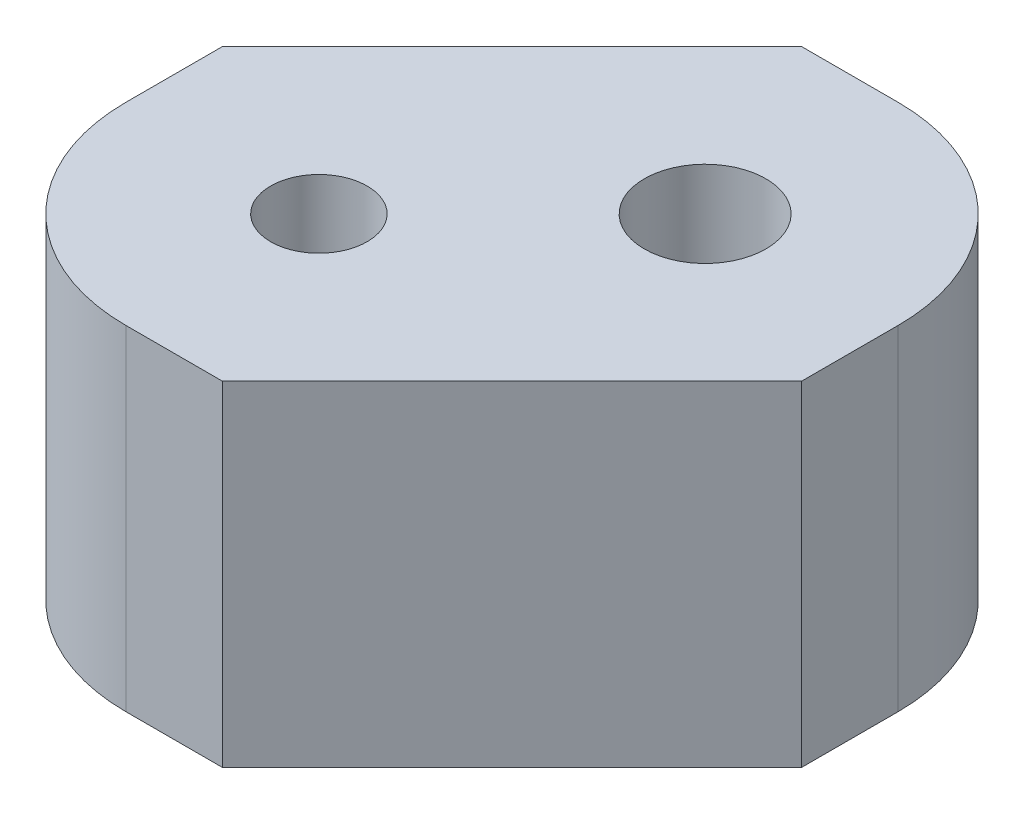
ISO-10303-21;
HEADER;
FILE_DESCRIPTION(('STEP AP214'),'2;1');
FILE_NAME('part.step','',(''),(''),'','','');
FILE_SCHEMA(('AUTOMOTIVE_DESIGN { 1 0 10303 214 1 1 1 1 }'));
ENDSEC;
DATA;
#1=APPLICATION_CONTEXT('core data for automotive mechanical design processes');
#2=APPLICATION_PROTOCOL_DEFINITION('international standard','automotive_design',2000,#1);
#3=PRODUCT_CONTEXT('',#1,'mechanical');
#4=PRODUCT('Part','Part','',(#3));
#5=PRODUCT_RELATED_PRODUCT_CATEGORY('part','',(#4));
#6=PRODUCT_DEFINITION_FORMATION('','',#4);
#7=PRODUCT_DEFINITION_CONTEXT('part definition',#1,'design');
#8=PRODUCT_DEFINITION('design','',#6,#7);
#9=PRODUCT_DEFINITION_SHAPE('','',#8);
#10=(LENGTH_UNIT() NAMED_UNIT(*) SI_UNIT(.MILLI.,.METRE.));
#11=(NAMED_UNIT(*) PLANE_ANGLE_UNIT() SI_UNIT($,.RADIAN.));
#12=(NAMED_UNIT(*) SI_UNIT($,.STERADIAN.) SOLID_ANGLE_UNIT());
#13=UNCERTAINTY_MEASURE_WITH_UNIT(LENGTH_MEASURE(1.E-05),#10,'distance_accuracy_value','');
#14=(GEOMETRIC_REPRESENTATION_CONTEXT(3) GLOBAL_UNCERTAINTY_ASSIGNED_CONTEXT((#13)) GLOBAL_UNIT_ASSIGNED_CONTEXT((#10,
#11,#12)) REPRESENTATION_CONTEXT('',''));
#15=CARTESIAN_POINT('',(0.,0.,0.));
#16=DIRECTION('',(0.,0.,1.));
#17=DIRECTION('',(1.,0.,0.));
#18=AXIS2_PLACEMENT_3D('',#15,#16,#17);
#19=CARTESIAN_POINT('',(-3.175,0.,3.175));
#20=DIRECTION('',(0.,1.,0.));
#21=DIRECTION('',(0.,0.,1.));
#22=AXIS2_PLACEMENT_3D('',#19,#20,#21);
#23=CYLINDRICAL_SURFACE('',#22,1.5875);
#24=CARTESIAN_POINT('',(-3.175,11.,3.175));
#25=DIRECTION('',(0.,1.,0.));
#26=DIRECTION('',(0.,0.,1.));
#27=AXIS2_PLACEMENT_3D('',#24,#25,#26);
#28=CIRCLE('',#27,1.5875);
#29=CARTESIAN_POINT('',(-3.175,11.,4.7625));
#30=VERTEX_POINT('',#29);
#31=EDGE_CURVE('E175',#30,#30,#28,.T.);
#32=ORIENTED_EDGE('',*,*,#31,.T.);
#33=EDGE_LOOP('',(#32));
#34=FACE_BOUND('',#33,.T.);
#35=CARTESIAN_POINT('',(-3.175,5.7,3.175));
#36=DIRECTION('',(0.,-1.,0.));
#37=DIRECTION('',(0.,0.,-1.));
#38=AXIS2_PLACEMENT_3D('',#35,#36,#37);
#39=CIRCLE('',#38,1.5875);
#40=CARTESIAN_POINT('',(-3.175,5.7,1.5875));
#41=VERTEX_POINT('',#40);
#42=EDGE_CURVE('E162',#41,#41,#39,.F.);
#43=ORIENTED_EDGE('',*,*,#42,.F.);
#44=EDGE_LOOP('',(#43));
#45=FACE_BOUND('',#44,.T.);
#46=ADVANCED_FACE('F42',(#34,#45),#23,.F.);
#47=CARTESIAN_POINT('',(3.175,0.,-3.175));
#48=DIRECTION('',(0.,1.,0.));
#49=DIRECTION('',(0.,0.,1.));
#50=AXIS2_PLACEMENT_3D('',#47,#48,#49);
#51=CYLINDRICAL_SURFACE('',#50,1.5875);
#52=CARTESIAN_POINT('',(3.175,0.,-3.175));
#53=DIRECTION('',(0.,1.,0.));
#54=DIRECTION('',(0.,0.,1.));
#55=AXIS2_PLACEMENT_3D('',#52,#53,#54);
#56=CIRCLE('',#55,1.5875);
#57=CARTESIAN_POINT('',(3.175,0.,-1.5875));
#58=VERTEX_POINT('',#57);
#59=EDGE_CURVE('E180',#58,#58,#56,.T.);
#60=ORIENTED_EDGE('',*,*,#59,.F.);
#61=EDGE_LOOP('',(#60));
#62=FACE_BOUND('',#61,.T.);
#63=CARTESIAN_POINT('',(3.175,5.3,-3.175));
#64=DIRECTION('',(0.,1.,0.));
#65=DIRECTION('',(0.,0.,1.));
#66=AXIS2_PLACEMENT_3D('',#63,#64,#65);
#67=CIRCLE('',#66,1.5875);
#68=CARTESIAN_POINT('',(3.175,5.3,-1.5875));
#69=VERTEX_POINT('',#68);
#70=EDGE_CURVE('E170',#69,#69,#67,.F.);
#71=ORIENTED_EDGE('',*,*,#70,.F.);
#72=EDGE_LOOP('',(#71));
#73=FACE_BOUND('',#72,.T.);
#74=ADVANCED_FACE('F252',(#62,#73),#51,.F.);
#75=CARTESIAN_POINT('',(9.525,11.,9.525));
#76=DIRECTION('',(-1.,0.,0.));
#77=DIRECTION('',(0.,0.,1.));
#78=AXIS2_PLACEMENT_3D('',#75,#76,#77);
#79=PLANE('',#78);
#80=DIRECTION('',(0.,0.,-1.));
#81=VECTOR('',#80,1.);
#82=CARTESIAN_POINT('',(9.525,0.,9.525));
#83=LINE('',#82,#81);
#84=CARTESIAN_POINT('',(9.525,0.,0.));
#85=VERTEX_POINT('',#84);
#86=CARTESIAN_POINT('',(9.525,0.,-3.175));
#87=VERTEX_POINT('',#86);
#88=EDGE_CURVE('E179',#85,#87,#83,.T.);
#89=ORIENTED_EDGE('',*,*,#88,.T.);
#90=DIRECTION('',(0.,-1.,0.));
#91=VECTOR('',#90,1.);
#92=CARTESIAN_POINT('',(9.525,11.,-3.175));
#93=LINE('',#92,#91);
#94=CARTESIAN_POINT('',(9.525,11.,-3.175));
#95=VERTEX_POINT('',#94);
#96=EDGE_CURVE('E11',#87,#95,#93,.F.);
#97=ORIENTED_EDGE('',*,*,#96,.T.);
#98=DIRECTION('',(0.,0.,-1.));
#99=VECTOR('',#98,1.);
#100=CARTESIAN_POINT('',(9.525,11.,9.525));
#101=LINE('',#100,#99);
#102=CARTESIAN_POINT('',(9.525,11.,0.));
#103=VERTEX_POINT('',#102);
#104=EDGE_CURVE('E184',#103,#95,#101,.T.);
#105=ORIENTED_EDGE('',*,*,#104,.F.);
#106=DIRECTION('',(0.,1.,0.));
#107=VECTOR('',#106,1.);
#108=CARTESIAN_POINT('',(9.525,0.,0.));
#109=LINE('',#108,#107);
#110=EDGE_CURVE('E128',#85,#103,#109,.T.);
#111=ORIENTED_EDGE('',*,*,#110,.F.);
#112=EDGE_LOOP('',(#89,#97,#105,#111));
#113=FACE_BOUND('',#112,.T.);
#114=ADVANCED_FACE('F246',(#113),#79,.F.);
#115=CARTESIAN_POINT('',(-9.525,11.,-9.525));
#116=DIRECTION('',(0.,0.,1.));
#117=DIRECTION('',(1.,0.,0.));
#118=AXIS2_PLACEMENT_3D('',#115,#116,#117);
#119=PLANE('',#118);
#120=DIRECTION('',(-1.,0.,0.));
#121=VECTOR('',#120,1.);
#122=CARTESIAN_POINT('',(-9.525,11.,-9.525));
#123=LINE('',#122,#121);
#124=CARTESIAN_POINT('',(3.175,11.,-9.525));
#125=VERTEX_POINT('',#124);
#126=CARTESIAN_POINT('',(0.,11.,-9.525));
#127=VERTEX_POINT('',#126);
#128=EDGE_CURVE('E187',#125,#127,#123,.T.);
#129=ORIENTED_EDGE('',*,*,#128,.F.);
#130=DIRECTION('',(0.,-1.,0.));
#131=VECTOR('',#130,1.);
#132=CARTESIAN_POINT('',(3.175,11.,-9.525));
#133=LINE('',#132,#131);
#134=CARTESIAN_POINT('',(3.175,0.,-9.525));
#135=VERTEX_POINT('',#134);
#136=EDGE_CURVE('E51',#125,#135,#133,.T.);
#137=ORIENTED_EDGE('',*,*,#136,.T.);
#138=DIRECTION('',(-1.,0.,0.));
#139=VECTOR('',#138,1.);
#140=CARTESIAN_POINT('',(-9.525,0.,-9.525));
#141=LINE('',#140,#139);
#142=CARTESIAN_POINT('',(0.,0.,-9.525));
#143=VERTEX_POINT('',#142);
#144=EDGE_CURVE('E194',#135,#143,#141,.T.);
#145=ORIENTED_EDGE('',*,*,#144,.T.);
#146=DIRECTION('',(0.,1.,0.));
#147=VECTOR('',#146,1.);
#148=CARTESIAN_POINT('',(0.,0.,-9.525));
#149=LINE('',#148,#147);
#150=EDGE_CURVE('E151',#143,#127,#149,.T.);
#151=ORIENTED_EDGE('',*,*,#150,.T.);
#152=EDGE_LOOP('',(#129,#137,#145,#151));
#153=FACE_BOUND('',#152,.T.);
#154=ADVANCED_FACE('F228',(#153),#119,.F.);
#155=CARTESIAN_POINT('',(-9.525,11.,9.525));
#156=DIRECTION('',(1.,0.,0.));
#157=DIRECTION('',(0.,0.,-1.));
#158=AXIS2_PLACEMENT_3D('',#155,#156,#157);
#159=PLANE('',#158);
#160=DIRECTION('',(0.,0.,1.));
#161=VECTOR('',#160,1.);
#162=CARTESIAN_POINT('',(-9.525,0.,9.525));
#163=LINE('',#162,#161);
#164=CARTESIAN_POINT('',(-9.525,0.,0.));
#165=VERTEX_POINT('',#164);
#166=CARTESIAN_POINT('',(-9.525,0.,3.175));
#167=VERTEX_POINT('',#166);
#168=EDGE_CURVE('E197',#165,#167,#163,.T.);
#169=ORIENTED_EDGE('',*,*,#168,.T.);
#170=DIRECTION('',(0.,-1.,0.));
#171=VECTOR('',#170,1.);
#172=CARTESIAN_POINT('',(-9.525,11.,3.175));
#173=LINE('',#172,#171);
#174=CARTESIAN_POINT('',(-9.525,11.,3.175));
#175=VERTEX_POINT('',#174);
#176=EDGE_CURVE('E217',#167,#175,#173,.F.);
#177=ORIENTED_EDGE('',*,*,#176,.T.);
#178=DIRECTION('',(0.,0.,1.));
#179=VECTOR('',#178,1.);
#180=CARTESIAN_POINT('',(-9.525,11.,9.525));
#181=LINE('',#180,#179);
#182=CARTESIAN_POINT('',(-9.525,11.,0.));
#183=VERTEX_POINT('',#182);
#184=EDGE_CURVE('E120',#183,#175,#181,.T.);
#185=ORIENTED_EDGE('',*,*,#184,.F.);
#186=DIRECTION('',(0.,1.,0.));
#187=VECTOR('',#186,1.);
#188=CARTESIAN_POINT('',(-9.525,0.,0.));
#189=LINE('',#188,#187);
#190=EDGE_CURVE('E147',#165,#183,#189,.T.);
#191=ORIENTED_EDGE('',*,*,#190,.F.);
#192=EDGE_LOOP('',(#169,#177,#185,#191));
#193=FACE_BOUND('',#192,.T.);
#194=ADVANCED_FACE('F242',(#193),#159,.F.);
#195=CARTESIAN_POINT('',(-9.525,11.,9.525));
#196=DIRECTION('',(0.,0.,-1.));
#197=DIRECTION('',(-1.,0.,0.));
#198=AXIS2_PLACEMENT_3D('',#195,#196,#197);
#199=PLANE('',#198);
#200=DIRECTION('',(1.,0.,0.));
#201=VECTOR('',#200,1.);
#202=CARTESIAN_POINT('',(-9.525,11.,9.525));
#203=LINE('',#202,#201);
#204=CARTESIAN_POINT('',(-3.175,11.,9.525));
#205=VERTEX_POINT('',#204);
#206=CARTESIAN_POINT('',(0.,11.,9.525));
#207=VERTEX_POINT('',#206);
#208=EDGE_CURVE('E107',#205,#207,#203,.T.);
#209=ORIENTED_EDGE('',*,*,#208,.F.);
#210=DIRECTION('',(0.,-1.,0.));
#211=VECTOR('',#210,1.);
#212=CARTESIAN_POINT('',(-3.175,11.,9.525));
#213=LINE('',#212,#211);
#214=CARTESIAN_POINT('',(-3.175,0.,9.525));
#215=VERTEX_POINT('',#214);
#216=EDGE_CURVE('E119',#205,#215,#213,.T.);
#217=ORIENTED_EDGE('',*,*,#216,.T.);
#218=DIRECTION('',(1.,0.,0.));
#219=VECTOR('',#218,1.);
#220=CARTESIAN_POINT('',(-9.525,0.,9.525));
#221=LINE('',#220,#219);
#222=CARTESIAN_POINT('',(0.,0.,9.525));
#223=VERTEX_POINT('',#222);
#224=EDGE_CURVE('E135',#215,#223,#221,.T.);
#225=ORIENTED_EDGE('',*,*,#224,.T.);
#226=DIRECTION('',(0.,1.,0.));
#227=VECTOR('',#226,1.);
#228=CARTESIAN_POINT('',(0.,0.,9.525));
#229=LINE('',#228,#227);
#230=EDGE_CURVE('E125',#223,#207,#229,.T.);
#231=ORIENTED_EDGE('',*,*,#230,.T.);
#232=EDGE_LOOP('',(#209,#217,#225,#231));
#233=FACE_BOUND('',#232,.T.);
#234=ADVANCED_FACE('F133',(#233),#199,.F.);
#235=CARTESIAN_POINT('',(0.,11.,0.));
#236=DIRECTION('',(0.,-1.,0.));
#237=DIRECTION('',(0.,0.,-1.));
#238=AXIS2_PLACEMENT_3D('',#235,#236,#237);
#239=PLANE('',#238);
#240=CARTESIAN_POINT('',(3.175,11.,-3.175));
#241=DIRECTION('',(0.,1.,0.));
#242=DIRECTION('',(0.,0.,1.));
#243=AXIS2_PLACEMENT_3D('',#240,#241,#242);
#244=CIRCLE('',#243,2.);
#245=CARTESIAN_POINT('',(3.175,11.,-1.175));
#246=VERTEX_POINT('',#245);
#247=EDGE_CURVE('E171',#246,#246,#244,.T.);
#248=ORIENTED_EDGE('',*,*,#247,.F.);
#249=EDGE_LOOP('',(#248));
#250=FACE_BOUND('',#249,.T.);
#251=ORIENTED_EDGE('',*,*,#31,.F.);
#252=EDGE_LOOP('',(#251));
#253=FACE_BOUND('',#252,.T.);
#254=ORIENTED_EDGE('',*,*,#184,.T.);
#255=CARTESIAN_POINT('',(-3.175,11.,3.175));
#256=DIRECTION('',(0.,-1.,0.));
#257=DIRECTION('',(0.,0.,-1.));
#258=AXIS2_PLACEMENT_3D('',#255,#256,#257);
#259=CIRCLE('',#258,6.35);
#260=EDGE_CURVE('E113',#175,#205,#259,.F.);
#261=ORIENTED_EDGE('',*,*,#260,.T.);
#262=ORIENTED_EDGE('',*,*,#208,.T.);
#263=DIRECTION('',(-0.707106781186548,0.,0.707106781186547));
#264=VECTOR('',#263,1.);
#265=CARTESIAN_POINT('',(0.,11.,9.525));
#266=LINE('',#265,#264);
#267=EDGE_CURVE('E111',#103,#207,#266,.T.);
#268=ORIENTED_EDGE('',*,*,#267,.F.);
#269=ORIENTED_EDGE('',*,*,#104,.T.);
#270=CARTESIAN_POINT('',(3.175,11.,-3.175));
#271=DIRECTION('',(0.,-1.,0.));
#272=DIRECTION('',(0.,0.,-1.));
#273=AXIS2_PLACEMENT_3D('',#270,#271,#272);
#274=CIRCLE('',#273,6.35);
#275=EDGE_CURVE('E58',#95,#125,#274,.F.);
#276=ORIENTED_EDGE('',*,*,#275,.T.);
#277=ORIENTED_EDGE('',*,*,#128,.T.);
#278=DIRECTION('',(0.707106781186548,0.,-0.707106781186547));
#279=VECTOR('',#278,1.);
#280=CARTESIAN_POINT('',(0.,11.,-9.525));
#281=LINE('',#280,#279);
#282=EDGE_CURVE('E130',#183,#127,#281,.T.);
#283=ORIENTED_EDGE('',*,*,#282,.F.);
#284=EDGE_LOOP('',(#254,#261,#262,#268,#269,#276,#277,#283));
#285=FACE_BOUND('',#284,.T.);
#286=ADVANCED_FACE('F110',(#250,#253,#285),#239,.F.);
#287=CARTESIAN_POINT('',(0.,0.,0.));
#288=DIRECTION('',(0.,-1.,0.));
#289=DIRECTION('',(0.,0.,-1.));
#290=AXIS2_PLACEMENT_3D('',#287,#288,#289);
#291=PLANE('',#290);
#292=ORIENTED_EDGE('',*,*,#224,.F.);
#293=CARTESIAN_POINT('',(-3.175,0.,3.175));
#294=DIRECTION('',(0.,-1.,0.));
#295=DIRECTION('',(0.,0.,-1.));
#296=AXIS2_PLACEMENT_3D('',#293,#294,#295);
#297=CIRCLE('',#296,6.35);
#298=EDGE_CURVE('E214',#215,#167,#297,.T.);
#299=ORIENTED_EDGE('',*,*,#298,.T.);
#300=ORIENTED_EDGE('',*,*,#168,.F.);
#301=DIRECTION('',(0.707106781186548,0.,-0.707106781186547));
#302=VECTOR('',#301,1.);
#303=CARTESIAN_POINT('',(0.,0.,-9.525));
#304=LINE('',#303,#302);
#305=EDGE_CURVE('E143',#165,#143,#304,.T.);
#306=ORIENTED_EDGE('',*,*,#305,.T.);
#307=ORIENTED_EDGE('',*,*,#144,.F.);
#308=CARTESIAN_POINT('',(3.175,0.,-3.175));
#309=DIRECTION('',(0.,-1.,0.));
#310=DIRECTION('',(0.,0.,-1.));
#311=AXIS2_PLACEMENT_3D('',#308,#309,#310);
#312=CIRCLE('',#311,6.35);
#313=EDGE_CURVE('E211',#135,#87,#312,.T.);
#314=ORIENTED_EDGE('',*,*,#313,.T.);
#315=ORIENTED_EDGE('',*,*,#88,.F.);
#316=DIRECTION('',(-0.707106781186548,0.,0.707106781186547));
#317=VECTOR('',#316,1.);
#318=CARTESIAN_POINT('',(0.,0.,9.525));
#319=LINE('',#318,#317);
#320=EDGE_CURVE('E131',#85,#223,#319,.T.);
#321=ORIENTED_EDGE('',*,*,#320,.T.);
#322=EDGE_LOOP('',(#292,#299,#300,#306,#307,#314,#315,#321));
#323=FACE_BOUND('',#322,.T.);
#324=CARTESIAN_POINT('',(-3.175,0.,3.175));
#325=DIRECTION('',(0.,-1.,0.));
#326=DIRECTION('',(0.,0.,-1.));
#327=AXIS2_PLACEMENT_3D('',#324,#325,#326);
#328=CIRCLE('',#327,2.);
#329=CARTESIAN_POINT('',(-3.175,0.,1.175));
#330=VERTEX_POINT('',#329);
#331=EDGE_CURVE('E155',#330,#330,#328,.T.);
#332=ORIENTED_EDGE('',*,*,#331,.F.);
#333=EDGE_LOOP('',(#332));
#334=FACE_BOUND('',#333,.T.);
#335=ORIENTED_EDGE('',*,*,#59,.T.);
#336=EDGE_LOOP('',(#335));
#337=FACE_BOUND('',#336,.T.);
#338=ADVANCED_FACE('F232',(#323,#334,#337),#291,.T.);
#339=CARTESIAN_POINT('',(3.175,5.3,-3.175));
#340=DIRECTION('',(0.,1.,0.));
#341=DIRECTION('',(0.,0.,1.));
#342=AXIS2_PLACEMENT_3D('',#339,#340,#341);
#343=PLANE('',#342);
#344=CARTESIAN_POINT('',(3.175,5.3,-3.175));
#345=DIRECTION('',(0.,1.,0.));
#346=DIRECTION('',(0.,0.,1.));
#347=AXIS2_PLACEMENT_3D('',#344,#345,#346);
#348=CIRCLE('',#347,2.);
#349=CARTESIAN_POINT('',(3.175,5.3,-1.175));
#350=VERTEX_POINT('',#349);
#351=EDGE_CURVE('E166',#350,#350,#348,.T.);
#352=ORIENTED_EDGE('',*,*,#351,.T.);
#353=EDGE_LOOP('',(#352));
#354=FACE_BOUND('',#353,.T.);
#355=ORIENTED_EDGE('',*,*,#70,.T.);
#356=EDGE_LOOP('',(#355));
#357=FACE_BOUND('',#356,.T.);
#358=ADVANCED_FACE('F270',(#354,#357),#343,.T.);
#359=CARTESIAN_POINT('',(3.175,5.3,-3.175));
#360=DIRECTION('',(0.,1.,0.));
#361=DIRECTION('',(0.,0.,1.));
#362=AXIS2_PLACEMENT_3D('',#359,#360,#361);
#363=CYLINDRICAL_SURFACE('',#362,2.);
#364=ORIENTED_EDGE('',*,*,#351,.F.);
#365=EDGE_LOOP('',(#364));
#366=FACE_BOUND('',#365,.T.);
#367=ORIENTED_EDGE('',*,*,#247,.T.);
#368=EDGE_LOOP('',(#367));
#369=FACE_BOUND('',#368,.T.);
#370=ADVANCED_FACE('F262',(#366,#369),#363,.F.);
#371=CARTESIAN_POINT('',(-3.175,5.7,3.175));
#372=DIRECTION('',(0.,-1.,0.));
#373=DIRECTION('',(0.,0.,-1.));
#374=AXIS2_PLACEMENT_3D('',#371,#372,#373);
#375=PLANE('',#374);
#376=CARTESIAN_POINT('',(-3.175,5.7,3.175));
#377=DIRECTION('',(0.,-1.,0.));
#378=DIRECTION('',(0.,0.,-1.));
#379=AXIS2_PLACEMENT_3D('',#376,#377,#378);
#380=CIRCLE('',#379,2.);
#381=CARTESIAN_POINT('',(-3.175,5.7,1.175));
#382=VERTEX_POINT('',#381);
#383=EDGE_CURVE('E158',#382,#382,#380,.T.);
#384=ORIENTED_EDGE('',*,*,#383,.T.);
#385=EDGE_LOOP('',(#384));
#386=FACE_BOUND('',#385,.T.);
#387=ORIENTED_EDGE('',*,*,#42,.T.);
#388=EDGE_LOOP('',(#387));
#389=FACE_BOUND('',#388,.T.);
#390=ADVANCED_FACE('F316',(#386,#389),#375,.T.);
#391=CARTESIAN_POINT('',(-3.175,5.7,3.175));
#392=DIRECTION('',(0.,-1.,0.));
#393=DIRECTION('',(0.,0.,-1.));
#394=AXIS2_PLACEMENT_3D('',#391,#392,#393);
#395=CYLINDRICAL_SURFACE('',#394,2.);
#396=ORIENTED_EDGE('',*,*,#383,.F.);
#397=EDGE_LOOP('',(#396));
#398=FACE_BOUND('',#397,.T.);
#399=ORIENTED_EDGE('',*,*,#331,.T.);
#400=EDGE_LOOP('',(#399));
#401=FACE_BOUND('',#400,.T.);
#402=ADVANCED_FACE('F323',(#398,#401),#395,.F.);
#403=CARTESIAN_POINT('',(0.,0.,-9.525));
#404=DIRECTION('',(0.707106781186547,0.,0.707106781186548));
#405=DIRECTION('',(0.707106781186548,0.,-0.707106781186547));
#406=AXIS2_PLACEMENT_3D('',#403,#404,#405);
#407=PLANE('',#406);
#408=ORIENTED_EDGE('',*,*,#282,.T.);
#409=ORIENTED_EDGE('',*,*,#150,.F.);
#410=ORIENTED_EDGE('',*,*,#305,.F.);
#411=ORIENTED_EDGE('',*,*,#190,.T.);
#412=EDGE_LOOP('',(#408,#409,#410,#411));
#413=FACE_BOUND('',#412,.T.);
#414=ADVANCED_FACE('F238',(#413),#407,.F.);
#415=CARTESIAN_POINT('',(0.,0.,9.525));
#416=DIRECTION('',(-0.707106781186547,0.,-0.707106781186548));
#417=DIRECTION('',(-0.707106781186548,0.,0.707106781186547));
#418=AXIS2_PLACEMENT_3D('',#415,#416,#417);
#419=PLANE('',#418);
#420=ORIENTED_EDGE('',*,*,#267,.T.);
#421=ORIENTED_EDGE('',*,*,#230,.F.);
#422=ORIENTED_EDGE('',*,*,#320,.F.);
#423=ORIENTED_EDGE('',*,*,#110,.T.);
#424=EDGE_LOOP('',(#420,#421,#422,#423));
#425=FACE_BOUND('',#424,.T.);
#426=ADVANCED_FACE('F124',(#425),#419,.F.);
#427=CARTESIAN_POINT('',(-3.175,11.,3.175));
#428=DIRECTION('',(0.,-1.,0.));
#429=DIRECTION('',(0.,0.,-1.));
#430=AXIS2_PLACEMENT_3D('',#427,#428,#429);
#431=CYLINDRICAL_SURFACE('',#430,6.35);
#432=ORIENTED_EDGE('',*,*,#260,.F.);
#433=ORIENTED_EDGE('',*,*,#176,.F.);
#434=ORIENTED_EDGE('',*,*,#298,.F.);
#435=ORIENTED_EDGE('',*,*,#216,.F.);
#436=EDGE_LOOP('',(#432,#433,#434,#435));
#437=FACE_BOUND('',#436,.T.);
#438=ADVANCED_FACE('F245',(#437),#431,.T.);
#439=CARTESIAN_POINT('',(3.175,11.,-3.175));
#440=DIRECTION('',(0.,-1.,0.));
#441=DIRECTION('',(0.,0.,-1.));
#442=AXIS2_PLACEMENT_3D('',#439,#440,#441);
#443=CYLINDRICAL_SURFACE('',#442,6.35);
#444=ORIENTED_EDGE('',*,*,#275,.F.);
#445=ORIENTED_EDGE('',*,*,#96,.F.);
#446=ORIENTED_EDGE('',*,*,#313,.F.);
#447=ORIENTED_EDGE('',*,*,#136,.F.);
#448=EDGE_LOOP('',(#444,#445,#446,#447));
#449=FACE_BOUND('',#448,.T.);
#450=ADVANCED_FACE('F44',(#449),#443,.T.);
#451=CLOSED_SHELL('',(#46,#74,#114,#154,#194,#234,#286,#338,#358,#370,#390,#402,#414,#426,#438,#450));
#452=MANIFOLD_SOLID_BREP('B2',#451);
#453=ADVANCED_BREP_SHAPE_REPRESENTATION('',(#18,#452),#14);
#454=SHAPE_DEFINITION_REPRESENTATION(#9,#453);
ENDSEC;
END-ISO-10303-21;
